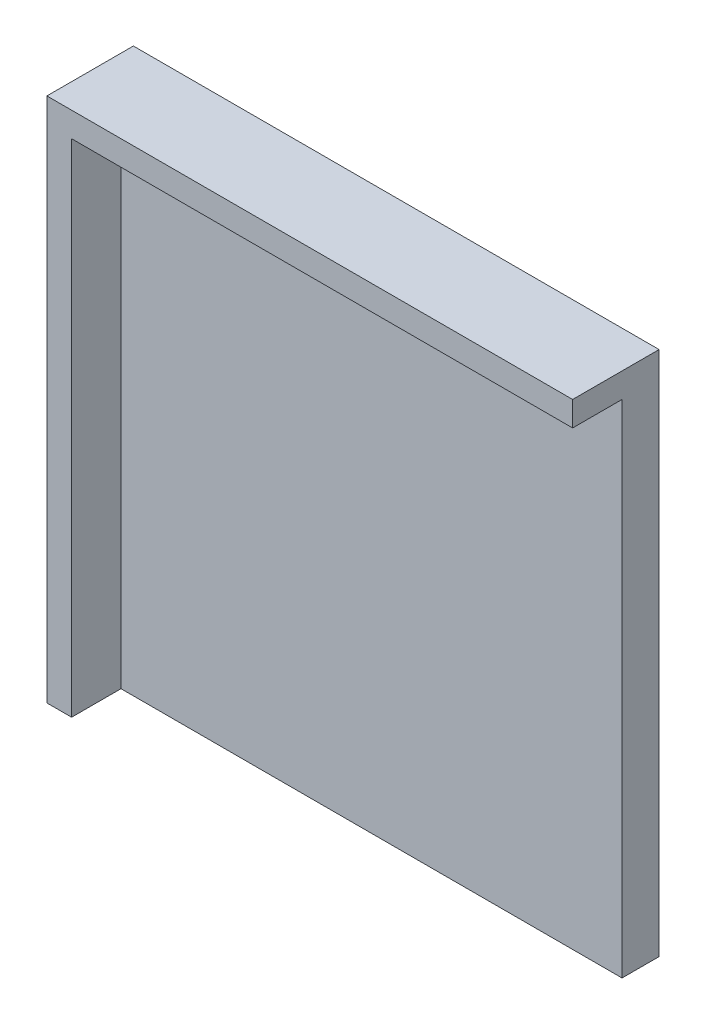
ISO-10303-21;
HEADER;
FILE_DESCRIPTION(('STEP AP214'),'2;1');
FILE_NAME('part.step','',(''),(''),'','','');
FILE_SCHEMA(('AUTOMOTIVE_DESIGN { 1 0 10303 214 1 1 1 1 }'));
ENDSEC;
DATA;
#1=APPLICATION_CONTEXT('core data for automotive mechanical design processes');
#2=APPLICATION_PROTOCOL_DEFINITION('international standard','automotive_design',2000,#1);
#3=PRODUCT_CONTEXT('',#1,'mechanical');
#4=PRODUCT('Part','Part','',(#3));
#5=PRODUCT_RELATED_PRODUCT_CATEGORY('part','',(#4));
#6=PRODUCT_DEFINITION_FORMATION('','',#4);
#7=PRODUCT_DEFINITION_CONTEXT('part definition',#1,'design');
#8=PRODUCT_DEFINITION('design','',#6,#7);
#9=PRODUCT_DEFINITION_SHAPE('','',#8);
#10=(LENGTH_UNIT() NAMED_UNIT(*) SI_UNIT(.MILLI.,.METRE.));
#11=(NAMED_UNIT(*) PLANE_ANGLE_UNIT() SI_UNIT($,.RADIAN.));
#12=(NAMED_UNIT(*) SI_UNIT($,.STERADIAN.) SOLID_ANGLE_UNIT());
#13=UNCERTAINTY_MEASURE_WITH_UNIT(LENGTH_MEASURE(1.E-05),#10,'distance_accuracy_value','');
#14=(GEOMETRIC_REPRESENTATION_CONTEXT(3) GLOBAL_UNCERTAINTY_ASSIGNED_CONTEXT((#13)) GLOBAL_UNIT_ASSIGNED_CONTEXT((#10,
#11,#12)) REPRESENTATION_CONTEXT('',''));
#15=CARTESIAN_POINT('',(0.,0.,0.));
#16=DIRECTION('',(0.,0.,1.));
#17=DIRECTION('',(1.,0.,0.));
#18=AXIS2_PLACEMENT_3D('',#15,#16,#17);
#19=CARTESIAN_POINT('',(-21.285,21.285,3.));
#20=DIRECTION('',(0.,-1.,0.));
#21=DIRECTION('',(1.,0.,0.));
#22=AXIS2_PLACEMENT_3D('',#19,#20,#21);
#23=PLANE('',#22);
#24=DIRECTION('',(-1.,0.,0.));
#25=VECTOR('',#24,1.);
#26=CARTESIAN_POINT('',(-21.285,21.285,0.));
#27=LINE('',#26,#25);
#28=CARTESIAN_POINT('',(21.285,21.285,0.));
#29=VERTEX_POINT('',#28);
#30=CARTESIAN_POINT('',(-21.285,21.285,0.));
#31=VERTEX_POINT('',#30);
#32=EDGE_CURVE('E145',#29,#31,#27,.T.);
#33=ORIENTED_EDGE('',*,*,#32,.T.);
#34=DIRECTION('',(0.,0.,-1.));
#35=VECTOR('',#34,1.);
#36=CARTESIAN_POINT('',(-21.285,21.285,3.));
#37=LINE('',#36,#35);
#38=CARTESIAN_POINT('',(-21.285,21.285,7.));
#39=VERTEX_POINT('',#38);
#40=EDGE_CURVE('E11',#39,#31,#37,.T.);
#41=ORIENTED_EDGE('',*,*,#40,.F.);
#42=DIRECTION('',(-1.,0.,0.));
#43=VECTOR('',#42,1.);
#44=CARTESIAN_POINT('',(21.285,21.285,7.));
#45=LINE('',#44,#43);
#46=CARTESIAN_POINT('',(21.285,21.285,7.));
#47=VERTEX_POINT('',#46);
#48=EDGE_CURVE('E112',#47,#39,#45,.T.);
#49=ORIENTED_EDGE('',*,*,#48,.F.);
#50=DIRECTION('',(0.,0.,-1.));
#51=VECTOR('',#50,1.);
#52=CARTESIAN_POINT('',(21.285,21.285,3.));
#53=LINE('',#52,#51);
#54=EDGE_CURVE('E96',#47,#29,#53,.T.);
#55=ORIENTED_EDGE('',*,*,#54,.T.);
#56=EDGE_LOOP('',(#33,#41,#49,#55));
#57=FACE_BOUND('',#56,.T.);
#58=ADVANCED_FACE('F39',(#57),#23,.F.);
#59=CARTESIAN_POINT('',(-21.285,-21.285,3.));
#60=DIRECTION('',(1.,0.,0.));
#61=DIRECTION('',(0.,1.,0.));
#62=AXIS2_PLACEMENT_3D('',#59,#60,#61);
#63=PLANE('',#62);
#64=DIRECTION('',(0.,-1.,0.));
#65=VECTOR('',#64,1.);
#66=CARTESIAN_POINT('',(-21.285,-21.285,0.));
#67=LINE('',#66,#65);
#68=CARTESIAN_POINT('',(-21.285,-21.285,0.));
#69=VERTEX_POINT('',#68);
#70=EDGE_CURVE('E149',#31,#69,#67,.T.);
#71=ORIENTED_EDGE('',*,*,#70,.T.);
#72=DIRECTION('',(0.,0.,-1.));
#73=VECTOR('',#72,1.);
#74=CARTESIAN_POINT('',(-21.285,-21.285,3.));
#75=LINE('',#74,#73);
#76=CARTESIAN_POINT('',(-21.285,-21.285,7.));
#77=VERTEX_POINT('',#76);
#78=EDGE_CURVE('E46',#77,#69,#75,.T.);
#79=ORIENTED_EDGE('',*,*,#78,.F.);
#80=DIRECTION('',(0.,-1.,0.));
#81=VECTOR('',#80,1.);
#82=CARTESIAN_POINT('',(-21.285,21.285,7.));
#83=LINE('',#82,#81);
#84=EDGE_CURVE('E113',#39,#77,#83,.T.);
#85=ORIENTED_EDGE('',*,*,#84,.F.);
#86=ORIENTED_EDGE('',*,*,#40,.T.);
#87=EDGE_LOOP('',(#71,#79,#85,#86));
#88=FACE_BOUND('',#87,.T.);
#89=ADVANCED_FACE('F163',(#88),#63,.F.);
#90=CARTESIAN_POINT('',(-21.285,-21.285,3.));
#91=DIRECTION('',(0.,1.,0.));
#92=DIRECTION('',(-1.,0.,0.));
#93=AXIS2_PLACEMENT_3D('',#90,#91,#92);
#94=PLANE('',#93);
#95=DIRECTION('',(1.,0.,0.));
#96=VECTOR('',#95,1.);
#97=CARTESIAN_POINT('',(-21.285,-21.285,0.));
#98=LINE('',#97,#96);
#99=CARTESIAN_POINT('',(21.285,-21.285,0.));
#100=VERTEX_POINT('',#99);
#101=EDGE_CURVE('E151',#69,#100,#98,.T.);
#102=ORIENTED_EDGE('',*,*,#101,.T.);
#103=DIRECTION('',(0.,0.,-1.));
#104=VECTOR('',#103,1.);
#105=CARTESIAN_POINT('',(21.285,-21.285,3.));
#106=LINE('',#105,#104);
#107=CARTESIAN_POINT('',(21.285,-21.285,3.));
#108=VERTEX_POINT('',#107);
#109=EDGE_CURVE('E107',#108,#100,#106,.T.);
#110=ORIENTED_EDGE('',*,*,#109,.F.);
#111=DIRECTION('',(1.,0.,0.));
#112=VECTOR('',#111,1.);
#113=CARTESIAN_POINT('',(-21.285,-21.285,3.));
#114=LINE('',#113,#112);
#115=CARTESIAN_POINT('',(-19.285,-21.285,3.));
#116=VERTEX_POINT('',#115);
#117=EDGE_CURVE('E144',#116,#108,#114,.T.);
#118=ORIENTED_EDGE('',*,*,#117,.F.);
#119=DIRECTION('',(0.,0.,-1.));
#120=VECTOR('',#119,1.);
#121=CARTESIAN_POINT('',(-19.285,-21.285,7.));
#122=LINE('',#121,#120);
#123=CARTESIAN_POINT('',(-19.285,-21.285,7.));
#124=VERTEX_POINT('',#123);
#125=EDGE_CURVE('E143',#124,#116,#122,.T.);
#126=ORIENTED_EDGE('',*,*,#125,.F.);
#127=DIRECTION('',(1.,0.,0.));
#128=VECTOR('',#127,1.);
#129=CARTESIAN_POINT('',(-21.285,-21.285,7.));
#130=LINE('',#129,#128);
#131=EDGE_CURVE('E129',#77,#124,#130,.T.);
#132=ORIENTED_EDGE('',*,*,#131,.F.);
#133=ORIENTED_EDGE('',*,*,#78,.T.);
#134=EDGE_LOOP('',(#102,#110,#118,#126,#132,#133));
#135=FACE_BOUND('',#134,.T.);
#136=ADVANCED_FACE('F158',(#135),#94,.F.);
#137=CARTESIAN_POINT('',(21.285,-21.285,3.));
#138=DIRECTION('',(-1.,0.,0.));
#139=DIRECTION('',(0.,0.,1.));
#140=AXIS2_PLACEMENT_3D('',#137,#138,#139);
#141=PLANE('',#140);
#142=DIRECTION('',(0.,1.,0.));
#143=VECTOR('',#142,1.);
#144=CARTESIAN_POINT('',(21.285,-21.285,0.));
#145=LINE('',#144,#143);
#146=EDGE_CURVE('E102',#100,#29,#145,.T.);
#147=ORIENTED_EDGE('',*,*,#146,.T.);
#148=ORIENTED_EDGE('',*,*,#54,.F.);
#149=DIRECTION('',(0.,1.,0.));
#150=VECTOR('',#149,1.);
#151=CARTESIAN_POINT('',(21.285,19.285,7.));
#152=LINE('',#151,#150);
#153=CARTESIAN_POINT('',(21.285,19.285,7.));
#154=VERTEX_POINT('',#153);
#155=EDGE_CURVE('E101',#154,#47,#152,.T.);
#156=ORIENTED_EDGE('',*,*,#155,.F.);
#157=DIRECTION('',(0.,0.,-1.));
#158=VECTOR('',#157,1.);
#159=CARTESIAN_POINT('',(21.285,19.285,7.));
#160=LINE('',#159,#158);
#161=CARTESIAN_POINT('',(21.285,19.285,3.));
#162=VERTEX_POINT('',#161);
#163=EDGE_CURVE('E135',#154,#162,#160,.T.);
#164=ORIENTED_EDGE('',*,*,#163,.T.);
#165=DIRECTION('',(0.,1.,0.));
#166=VECTOR('',#165,1.);
#167=CARTESIAN_POINT('',(21.285,-21.285,3.));
#168=LINE('',#167,#166);
#169=EDGE_CURVE('E52',#108,#162,#168,.T.);
#170=ORIENTED_EDGE('',*,*,#169,.F.);
#171=ORIENTED_EDGE('',*,*,#109,.T.);
#172=EDGE_LOOP('',(#147,#148,#156,#164,#170,#171));
#173=FACE_BOUND('',#172,.T.);
#174=ADVANCED_FACE('F98',(#173),#141,.F.);
#175=CARTESIAN_POINT('',(0.,0.,3.));
#176=DIRECTION('',(0.,0.,1.));
#177=DIRECTION('',(1.,0.,0.));
#178=AXIS2_PLACEMENT_3D('',#175,#176,#177);
#179=PLANE('',#178);
#180=DIRECTION('',(1.,0.,0.));
#181=VECTOR('',#180,1.);
#182=CARTESIAN_POINT('',(-19.285,19.285,3.));
#183=LINE('',#182,#181);
#184=CARTESIAN_POINT('',(-19.285,19.285,3.));
#185=VERTEX_POINT('',#184);
#186=EDGE_CURVE('E121',#185,#162,#183,.T.);
#187=ORIENTED_EDGE('',*,*,#186,.F.);
#188=DIRECTION('',(0.,1.,0.));
#189=VECTOR('',#188,1.);
#190=CARTESIAN_POINT('',(-19.285,-21.285,3.));
#191=LINE('',#190,#189);
#192=EDGE_CURVE('E59',#116,#185,#191,.T.);
#193=ORIENTED_EDGE('',*,*,#192,.F.);
#194=ORIENTED_EDGE('',*,*,#117,.T.);
#195=ORIENTED_EDGE('',*,*,#169,.T.);
#196=EDGE_LOOP('',(#187,#193,#194,#195));
#197=FACE_BOUND('',#196,.T.);
#198=ADVANCED_FACE('F173',(#197),#179,.T.);
#199=CARTESIAN_POINT('',(0.,0.,0.));
#200=DIRECTION('',(0.,0.,1.));
#201=DIRECTION('',(1.,0.,0.));
#202=AXIS2_PLACEMENT_3D('',#199,#200,#201);
#203=PLANE('',#202);
#204=CARTESIAN_POINT('',(-14.2139321881345,14.2139321881345,0.));
#205=DIRECTION('',(0.,0.,-1.));
#206=DIRECTION('',(-1.,0.,0.));
#207=AXIS2_PLACEMENT_3D('',#204,#205,#206);
#208=CIRCLE('',#207,2.1);
#209=CARTESIAN_POINT('',(-16.3139321881345,14.2139321881345,0.));
#210=VERTEX_POINT('',#209);
#211=EDGE_CURVE('E267',#210,#210,#208,.T.);
#212=ORIENTED_EDGE('',*,*,#211,.F.);
#213=EDGE_LOOP('',(#212));
#214=FACE_BOUND('',#213,.T.);
#215=CARTESIAN_POINT('',(14.2139321881345,-14.2139321881345,0.));
#216=DIRECTION('',(0.,0.,-1.));
#217=DIRECTION('',(-1.,0.,0.));
#218=AXIS2_PLACEMENT_3D('',#215,#216,#217);
#219=CIRCLE('',#218,2.1);
#220=CARTESIAN_POINT('',(12.1139321881345,-14.2139321881345,0.));
#221=VERTEX_POINT('',#220);
#222=EDGE_CURVE('E275',#221,#221,#219,.T.);
#223=ORIENTED_EDGE('',*,*,#222,.F.);
#224=EDGE_LOOP('',(#223));
#225=FACE_BOUND('',#224,.T.);
#226=ORIENTED_EDGE('',*,*,#32,.F.);
#227=ORIENTED_EDGE('',*,*,#146,.F.);
#228=ORIENTED_EDGE('',*,*,#101,.F.);
#229=ORIENTED_EDGE('',*,*,#70,.F.);
#230=EDGE_LOOP('',(#226,#227,#228,#229));
#231=FACE_BOUND('',#230,.T.);
#232=ADVANCED_FACE('F162',(#214,#225,#231),#203,.F.);
#233=CARTESIAN_POINT('',(-19.285,-21.285,7.));
#234=DIRECTION('',(-1.,0.,0.));
#235=DIRECTION('',(0.,-1.,0.));
#236=AXIS2_PLACEMENT_3D('',#233,#234,#235);
#237=PLANE('',#236);
#238=ORIENTED_EDGE('',*,*,#192,.T.);
#239=DIRECTION('',(0.,0.,-1.));
#240=VECTOR('',#239,1.);
#241=CARTESIAN_POINT('',(-19.285,19.285,7.));
#242=LINE('',#241,#240);
#243=CARTESIAN_POINT('',(-19.285,19.285,7.));
#244=VERTEX_POINT('',#243);
#245=EDGE_CURVE('E139',#244,#185,#242,.T.);
#246=ORIENTED_EDGE('',*,*,#245,.F.);
#247=DIRECTION('',(0.,1.,0.));
#248=VECTOR('',#247,1.);
#249=CARTESIAN_POINT('',(-19.285,-21.285,7.));
#250=LINE('',#249,#248);
#251=EDGE_CURVE('E133',#124,#244,#250,.T.);
#252=ORIENTED_EDGE('',*,*,#251,.F.);
#253=ORIENTED_EDGE('',*,*,#125,.T.);
#254=EDGE_LOOP('',(#238,#246,#252,#253));
#255=FACE_BOUND('',#254,.T.);
#256=ADVANCED_FACE('F169',(#255),#237,.F.);
#257=CARTESIAN_POINT('',(-19.285,19.285,7.));
#258=DIRECTION('',(0.,1.,0.));
#259=DIRECTION('',(-1.,0.,0.));
#260=AXIS2_PLACEMENT_3D('',#257,#258,#259);
#261=PLANE('',#260);
#262=ORIENTED_EDGE('',*,*,#186,.T.);
#263=ORIENTED_EDGE('',*,*,#163,.F.);
#264=DIRECTION('',(1.,0.,0.));
#265=VECTOR('',#264,1.);
#266=CARTESIAN_POINT('',(-19.285,19.285,7.));
#267=LINE('',#266,#265);
#268=EDGE_CURVE('E120',#244,#154,#267,.T.);
#269=ORIENTED_EDGE('',*,*,#268,.F.);
#270=ORIENTED_EDGE('',*,*,#245,.T.);
#271=EDGE_LOOP('',(#262,#263,#269,#270));
#272=FACE_BOUND('',#271,.T.);
#273=ADVANCED_FACE('F168',(#272),#261,.F.);
#274=CARTESIAN_POINT('',(0.,0.,7.));
#275=DIRECTION('',(0.,0.,1.));
#276=DIRECTION('',(1.,0.,0.));
#277=AXIS2_PLACEMENT_3D('',#274,#275,#276);
#278=PLANE('',#277);
#279=ORIENTED_EDGE('',*,*,#155,.T.);
#280=ORIENTED_EDGE('',*,*,#48,.T.);
#281=ORIENTED_EDGE('',*,*,#84,.T.);
#282=ORIENTED_EDGE('',*,*,#131,.T.);
#283=ORIENTED_EDGE('',*,*,#251,.T.);
#284=ORIENTED_EDGE('',*,*,#268,.T.);
#285=EDGE_LOOP('',(#279,#280,#281,#282,#283,#284));
#286=FACE_BOUND('',#285,.T.);
#287=ADVANCED_FACE('F119',(#286),#278,.T.);
#288=CARTESIAN_POINT('',(14.2139321881345,-14.2139321881345,2.));
#289=DIRECTION('',(0.,0.,-1.));
#290=DIRECTION('',(-1.,0.,0.));
#291=AXIS2_PLACEMENT_3D('',#288,#289,#290);
#292=CYLINDRICAL_SURFACE('',#291,2.1);
#293=CARTESIAN_POINT('',(14.2139321881345,-14.2139321881345,2.));
#294=DIRECTION('',(0.,0.,-1.));
#295=DIRECTION('',(-1.,0.,0.));
#296=AXIS2_PLACEMENT_3D('',#293,#294,#295);
#297=CIRCLE('',#296,2.1);
#298=CARTESIAN_POINT('',(12.1139321881345,-14.2139321881345,2.));
#299=VERTEX_POINT('',#298);
#300=EDGE_CURVE('E125',#299,#299,#297,.T.);
#301=ORIENTED_EDGE('',*,*,#300,.F.);
#302=EDGE_LOOP('',(#301));
#303=FACE_BOUND('',#302,.T.);
#304=ORIENTED_EDGE('',*,*,#222,.T.);
#305=EDGE_LOOP('',(#304));
#306=FACE_BOUND('',#305,.T.);
#307=ADVANCED_FACE('F223',(#303,#306),#292,.F.);
#308=CARTESIAN_POINT('',(14.2139321881345,-14.2139321881345,2.));
#309=DIRECTION('',(0.,0.,-1.));
#310=DIRECTION('',(-1.,0.,0.));
#311=AXIS2_PLACEMENT_3D('',#308,#309,#310);
#312=PLANE('',#311);
#313=ORIENTED_EDGE('',*,*,#300,.T.);
#314=EDGE_LOOP('',(#313));
#315=FACE_BOUND('',#314,.T.);
#316=ADVANCED_FACE('F233',(#315),#312,.T.);
#317=CARTESIAN_POINT('',(-14.2139321881345,14.2139321881345,2.));
#318=DIRECTION('',(0.,0.,-1.));
#319=DIRECTION('',(-1.,0.,0.));
#320=AXIS2_PLACEMENT_3D('',#317,#318,#319);
#321=CYLINDRICAL_SURFACE('',#320,2.1);
#322=CARTESIAN_POINT('',(-14.2139321881345,14.2139321881345,2.));
#323=DIRECTION('',(0.,0.,-1.));
#324=DIRECTION('',(-1.,0.,0.));
#325=AXIS2_PLACEMENT_3D('',#322,#323,#324);
#326=CIRCLE('',#325,2.1);
#327=CARTESIAN_POINT('',(-16.3139321881345,14.2139321881345,2.));
#328=VERTEX_POINT('',#327);
#329=EDGE_CURVE('E131',#328,#328,#326,.T.);
#330=ORIENTED_EDGE('',*,*,#329,.F.);
#331=EDGE_LOOP('',(#330));
#332=FACE_BOUND('',#331,.T.);
#333=ORIENTED_EDGE('',*,*,#211,.T.);
#334=EDGE_LOOP('',(#333));
#335=FACE_BOUND('',#334,.T.);
#336=ADVANCED_FACE('F245',(#332,#335),#321,.F.);
#337=CARTESIAN_POINT('',(-14.2139321881345,14.2139321881345,2.));
#338=DIRECTION('',(0.,0.,-1.));
#339=DIRECTION('',(-1.,0.,0.));
#340=AXIS2_PLACEMENT_3D('',#337,#338,#339);
#341=PLANE('',#340);
#342=ORIENTED_EDGE('',*,*,#329,.T.);
#343=EDGE_LOOP('',(#342));
#344=FACE_BOUND('',#343,.T.);
#345=ADVANCED_FACE('F255',(#344),#341,.T.);
#346=CLOSED_SHELL('',(#58,#89,#136,#174,#198,#232,#256,#273,#287,#307,#316,#336,#345));
#347=MANIFOLD_SOLID_BREP('B2',#346);
#348=ADVANCED_BREP_SHAPE_REPRESENTATION('',(#18,#347),#14);
#349=SHAPE_DEFINITION_REPRESENTATION(#9,#348);
ENDSEC;
END-ISO-10303-21;
